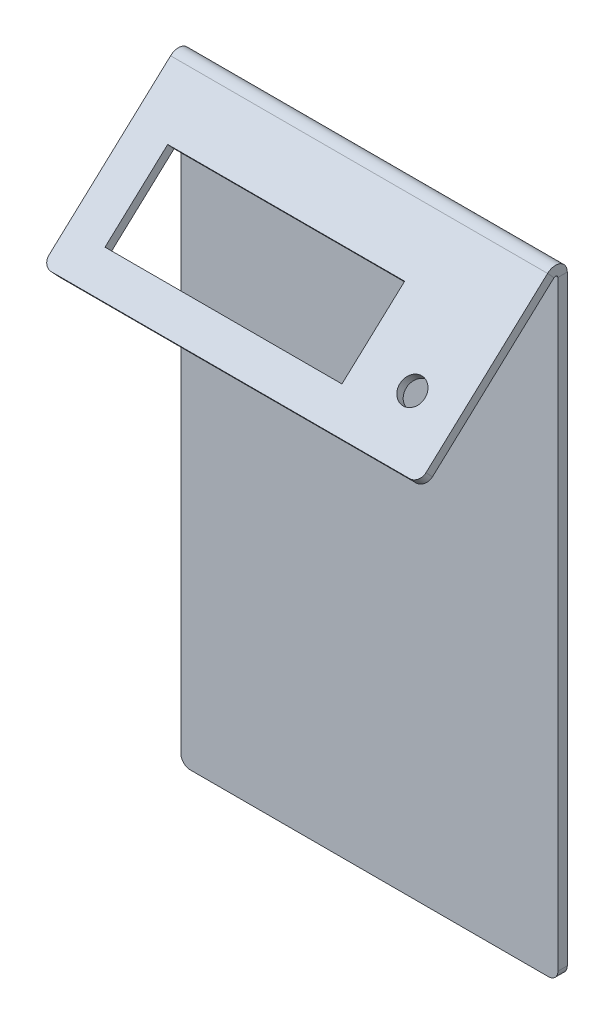
ISO-10303-21;
HEADER;
FILE_DESCRIPTION(('STEP AP214'),'2;1');
FILE_NAME('part.step','',(''),(''),'','','');
FILE_SCHEMA(('AUTOMOTIVE_DESIGN { 1 0 10303 214 1 1 1 1 }'));
ENDSEC;
DATA;
#1=APPLICATION_CONTEXT('core data for automotive mechanical design processes');
#2=APPLICATION_PROTOCOL_DEFINITION('international standard','automotive_design',2000,#1);
#3=PRODUCT_CONTEXT('',#1,'mechanical');
#4=PRODUCT('Part','Part','',(#3));
#5=PRODUCT_RELATED_PRODUCT_CATEGORY('part','',(#4));
#6=PRODUCT_DEFINITION_FORMATION('','',#4);
#7=PRODUCT_DEFINITION_CONTEXT('part definition',#1,'design');
#8=PRODUCT_DEFINITION('design','',#6,#7);
#9=PRODUCT_DEFINITION_SHAPE('','',#8);
#10=(LENGTH_UNIT() NAMED_UNIT(*) SI_UNIT(.MILLI.,.METRE.));
#11=(NAMED_UNIT(*) PLANE_ANGLE_UNIT() SI_UNIT($,.RADIAN.));
#12=(NAMED_UNIT(*) SI_UNIT($,.STERADIAN.) SOLID_ANGLE_UNIT());
#13=UNCERTAINTY_MEASURE_WITH_UNIT(LENGTH_MEASURE(1.E-05),#10,'distance_accuracy_value','');
#14=(GEOMETRIC_REPRESENTATION_CONTEXT(3) GLOBAL_UNCERTAINTY_ASSIGNED_CONTEXT((#13)) GLOBAL_UNIT_ASSIGNED_CONTEXT((#10,
#11,#12)) REPRESENTATION_CONTEXT('',''));
#15=CARTESIAN_POINT('',(0.,0.,0.));
#16=DIRECTION('',(0.,0.,1.));
#17=DIRECTION('',(1.,0.,0.));
#18=AXIS2_PLACEMENT_3D('',#15,#16,#17);
#19=CARTESIAN_POINT('',(0.,0.,-3.));
#20=DIRECTION('',(-1.,0.,0.));
#21=DIRECTION('',(0.,0.,1.));
#22=AXIS2_PLACEMENT_3D('',#19,#20,#21);
#23=PLANE('',#22);
#24=DIRECTION('',(0.,-1.,0.));
#25=VECTOR('',#24,1.);
#26=CARTESIAN_POINT('',(0.,0.,-3.));
#27=LINE('',#26,#25);
#28=CARTESIAN_POINT('',(0.,194.248339821906,-3.));
#29=VERTEX_POINT('',#28);
#30=CARTESIAN_POINT('',(0.,3.,-3.));
#31=VERTEX_POINT('',#30);
#32=EDGE_CURVE('E248',#29,#31,#27,.T.);
#33=ORIENTED_EDGE('',*,*,#32,.T.);
#34=DIRECTION('',(0.,0.,1.));
#35=VECTOR('',#34,1.);
#36=CARTESIAN_POINT('',(0.,3.,-3.));
#37=LINE('',#36,#35);
#38=CARTESIAN_POINT('',(0.,3.,0.));
#39=VERTEX_POINT('',#38);
#40=EDGE_CURVE('E278',#31,#39,#37,.T.);
#41=ORIENTED_EDGE('',*,*,#40,.T.);
#42=DIRECTION('',(0.,-1.,0.));
#43=VECTOR('',#42,1.);
#44=CARTESIAN_POINT('',(0.,0.,0.));
#45=LINE('',#44,#43);
#46=CARTESIAN_POINT('',(0.,194.248339821906,0.));
#47=VERTEX_POINT('',#46);
#48=EDGE_CURVE('E245',#47,#39,#45,.T.);
#49=ORIENTED_EDGE('',*,*,#48,.F.);
#50=DIRECTION('',(0.,0.,1.));
#51=VECTOR('',#50,1.);
#52=CARTESIAN_POINT('',(0.,194.248339821906,-3.));
#53=LINE('',#52,#51);
#54=EDGE_CURVE('E217',#29,#47,#53,.T.);
#55=ORIENTED_EDGE('',*,*,#54,.F.);
#56=EDGE_LOOP('',(#33,#41,#49,#55));
#57=FACE_BOUND('',#56,.T.);
#58=ADVANCED_FACE('F37',(#57),#23,.T.);
#59=CARTESIAN_POINT('',(120.,0.,-3.));
#60=DIRECTION('',(1.,0.,0.));
#61=DIRECTION('',(0.,0.,-1.));
#62=AXIS2_PLACEMENT_3D('',#59,#60,#61);
#63=PLANE('',#62);
#64=DIRECTION('',(0.,1.,0.));
#65=VECTOR('',#64,1.);
#66=CARTESIAN_POINT('',(120.,0.,0.));
#67=LINE('',#66,#65);
#68=CARTESIAN_POINT('',(120.,3.,0.));
#69=VERTEX_POINT('',#68);
#70=CARTESIAN_POINT('',(120.,194.248339821906,0.));
#71=VERTEX_POINT('',#70);
#72=EDGE_CURVE('E252',#69,#71,#67,.T.);
#73=ORIENTED_EDGE('',*,*,#72,.F.);
#74=DIRECTION('',(0.,0.,1.));
#75=VECTOR('',#74,1.);
#76=CARTESIAN_POINT('',(120.,3.,-3.));
#77=LINE('',#76,#75);
#78=CARTESIAN_POINT('',(120.,3.,-3.));
#79=VERTEX_POINT('',#78);
#80=EDGE_CURVE('E272',#69,#79,#77,.F.);
#81=ORIENTED_EDGE('',*,*,#80,.T.);
#82=DIRECTION('',(0.,1.,0.));
#83=VECTOR('',#82,1.);
#84=CARTESIAN_POINT('',(120.,0.,-3.));
#85=LINE('',#84,#83);
#86=CARTESIAN_POINT('',(120.,194.248339821906,-3.));
#87=VERTEX_POINT('',#86);
#88=EDGE_CURVE('E255',#79,#87,#85,.T.);
#89=ORIENTED_EDGE('',*,*,#88,.T.);
#90=DIRECTION('',(0.,0.,1.));
#91=VECTOR('',#90,1.);
#92=CARTESIAN_POINT('',(119.999999999998,194.248339821906,-3.));
#93=LINE('',#92,#91);
#94=EDGE_CURVE('E207',#87,#71,#93,.T.);
#95=ORIENTED_EDGE('',*,*,#94,.T.);
#96=EDGE_LOOP('',(#73,#81,#89,#95));
#97=FACE_BOUND('',#96,.T.);
#98=ADVANCED_FACE('F330',(#97),#63,.T.);
#99=CARTESIAN_POINT('',(0.,0.,-3.));
#100=DIRECTION('',(0.,0.,-1.));
#101=DIRECTION('',(-1.,0.,0.));
#102=AXIS2_PLACEMENT_3D('',#99,#100,#101);
#103=PLANE('',#102);
#104=ORIENTED_EDGE('',*,*,#88,.F.);
#105=CARTESIAN_POINT('',(117.,3.,-3.));
#106=DIRECTION('',(0.,0.,-1.));
#107=DIRECTION('',(-1.,0.,0.));
#108=AXIS2_PLACEMENT_3D('',#105,#106,#107);
#109=CIRCLE('',#108,3.);
#110=CARTESIAN_POINT('',(117.,0.,-3.));
#111=VERTEX_POINT('',#110);
#112=EDGE_CURVE('E276',#79,#111,#109,.T.);
#113=ORIENTED_EDGE('',*,*,#112,.T.);
#114=DIRECTION('',(1.,0.,0.));
#115=VECTOR('',#114,1.);
#116=CARTESIAN_POINT('',(0.,0.,-3.));
#117=LINE('',#116,#115);
#118=CARTESIAN_POINT('',(3.,0.,-3.));
#119=VERTEX_POINT('',#118);
#120=EDGE_CURVE('E251',#119,#111,#117,.T.);
#121=ORIENTED_EDGE('',*,*,#120,.F.);
#122=CARTESIAN_POINT('',(3.,3.,-3.));
#123=DIRECTION('',(0.,0.,-1.));
#124=DIRECTION('',(-1.,0.,0.));
#125=AXIS2_PLACEMENT_3D('',#122,#123,#124);
#126=CIRCLE('',#125,3.);
#127=EDGE_CURVE('E274',#119,#31,#126,.T.);
#128=ORIENTED_EDGE('',*,*,#127,.T.);
#129=ORIENTED_EDGE('',*,*,#32,.F.);
#130=DIRECTION('',(1.,0.,0.));
#131=VECTOR('',#130,1.);
#132=CARTESIAN_POINT('',(-600.,194.248339821906,-3.));
#133=LINE('',#132,#131);
#134=EDGE_CURVE('E208',#29,#87,#133,.T.);
#135=ORIENTED_EDGE('',*,*,#134,.T.);
#136=EDGE_LOOP('',(#104,#113,#121,#128,#129,#135));
#137=FACE_BOUND('',#136,.T.);
#138=ADVANCED_FACE('F324',(#137),#103,.T.);
#139=CARTESIAN_POINT('',(0.,0.,0.));
#140=DIRECTION('',(0.,0.,-1.));
#141=DIRECTION('',(-1.,0.,0.));
#142=AXIS2_PLACEMENT_3D('',#139,#140,#141);
#143=PLANE('',#142);
#144=DIRECTION('',(1.,0.,0.));
#145=VECTOR('',#144,1.);
#146=CARTESIAN_POINT('',(0.,0.,0.));
#147=LINE('',#146,#145);
#148=CARTESIAN_POINT('',(3.,0.,0.));
#149=VERTEX_POINT('',#148);
#150=CARTESIAN_POINT('',(117.,0.,0.));
#151=VERTEX_POINT('',#150);
#152=EDGE_CURVE('E260',#149,#151,#147,.T.);
#153=ORIENTED_EDGE('',*,*,#152,.T.);
#154=CARTESIAN_POINT('',(117.,3.,0.));
#155=DIRECTION('',(0.,0.,-1.));
#156=DIRECTION('',(-1.,0.,0.));
#157=AXIS2_PLACEMENT_3D('',#154,#155,#156);
#158=CIRCLE('',#157,3.);
#159=EDGE_CURVE('E270',#151,#69,#158,.F.);
#160=ORIENTED_EDGE('',*,*,#159,.T.);
#161=ORIENTED_EDGE('',*,*,#72,.T.);
#162=DIRECTION('',(1.,0.,0.));
#163=VECTOR('',#162,1.);
#164=CARTESIAN_POINT('',(-600.,194.248339821906,0.));
#165=LINE('',#164,#163);
#166=EDGE_CURVE('E197',#47,#71,#165,.T.);
#167=ORIENTED_EDGE('',*,*,#166,.F.);
#168=ORIENTED_EDGE('',*,*,#48,.T.);
#169=CARTESIAN_POINT('',(3.,3.,0.));
#170=DIRECTION('',(0.,0.,-1.));
#171=DIRECTION('',(-1.,0.,0.));
#172=AXIS2_PLACEMENT_3D('',#169,#170,#171);
#173=CIRCLE('',#172,3.);
#174=EDGE_CURVE('E268',#39,#149,#173,.F.);
#175=ORIENTED_EDGE('',*,*,#174,.T.);
#176=EDGE_LOOP('',(#153,#160,#161,#167,#168,#175));
#177=FACE_BOUND('',#176,.T.);
#178=ADVANCED_FACE('F333',(#177),#143,.F.);
#179=CARTESIAN_POINT('',(0.,0.,-3.));
#180=DIRECTION('',(0.,-1.,0.));
#181=DIRECTION('',(0.,0.,-1.));
#182=AXIS2_PLACEMENT_3D('',#179,#180,#181);
#183=PLANE('',#182);
#184=ORIENTED_EDGE('',*,*,#120,.T.);
#185=DIRECTION('',(0.,0.,1.));
#186=VECTOR('',#185,1.);
#187=CARTESIAN_POINT('',(117.,0.,-3.));
#188=LINE('',#187,#186);
#189=EDGE_CURVE('E265',#111,#151,#188,.T.);
#190=ORIENTED_EDGE('',*,*,#189,.T.);
#191=ORIENTED_EDGE('',*,*,#152,.F.);
#192=DIRECTION('',(0.,0.,1.));
#193=VECTOR('',#192,1.);
#194=CARTESIAN_POINT('',(3.,0.,-3.));
#195=LINE('',#194,#193);
#196=EDGE_CURVE('E257',#149,#119,#195,.F.);
#197=ORIENTED_EDGE('',*,*,#196,.T.);
#198=EDGE_LOOP('',(#184,#190,#191,#197));
#199=FACE_BOUND('',#198,.T.);
#200=ADVANCED_FACE('F339',(#199),#183,.T.);
#201=CARTESIAN_POINT('',(0.,159.401451515513,44.1787037038518));
#202=DIRECTION('',(0.,0.676642474741551,-0.736311728397443));
#203=DIRECTION('',(1.,0.,0.));
#204=AXIS2_PLACEMENT_3D('',#201,#202,#203);
#205=PLANE('',#204);
#206=DIRECTION('',(1.,0.,0.));
#207=VECTOR('',#206,1.);
#208=CARTESIAN_POINT('',(0.,159.401451515513,44.1787037038518));
#209=LINE('',#208,#207);
#210=CARTESIAN_POINT('',(3.,159.401451515513,44.1787037038518));
#211=VERTEX_POINT('',#210);
#212=CARTESIAN_POINT('',(117.,159.401451515513,44.1787037038518));
#213=VERTEX_POINT('',#212);
#214=EDGE_CURVE('E220',#211,#213,#209,.T.);
#215=ORIENTED_EDGE('',*,*,#214,.F.);
#216=DIRECTION('',(0.,-0.736311728397443,-0.676642474741551));
#217=VECTOR('',#216,1.);
#218=CARTESIAN_POINT('',(3.,159.401451515513,44.1787037038518));
#219=LINE('',#218,#217);
#220=CARTESIAN_POINT('',(3.,157.19251633032,42.1487762796271));
#221=VERTEX_POINT('',#220);
#222=EDGE_CURVE('E283',#211,#221,#219,.T.);
#223=ORIENTED_EDGE('',*,*,#222,.T.);
#224=DIRECTION('',(1.,0.,0.));
#225=VECTOR('',#224,1.);
#226=CARTESIAN_POINT('',(0.,157.19251633032,42.1487762796271));
#227=LINE('',#226,#225);
#228=CARTESIAN_POINT('',(117.,157.19251633032,42.1487762796271));
#229=VERTEX_POINT('',#228);
#230=EDGE_CURVE('E228',#221,#229,#227,.T.);
#231=ORIENTED_EDGE('',*,*,#230,.T.);
#232=DIRECTION('',(0.,-0.736311728397443,-0.676642474741551));
#233=VECTOR('',#232,1.);
#234=CARTESIAN_POINT('',(117.,159.401451515513,44.1787037038518));
#235=LINE('',#234,#233);
#236=EDGE_CURVE('E281',#229,#213,#235,.F.);
#237=ORIENTED_EDGE('',*,*,#236,.T.);
#238=EDGE_LOOP('',(#215,#223,#231,#237));
#239=FACE_BOUND('',#238,.T.);
#240=ADVANCED_FACE('F298',(#239),#205,.F.);
#241=CARTESIAN_POINT('',(0.,159.401451515513,44.1787037038518));
#242=DIRECTION('',(-1.,0.,0.));
#243=DIRECTION('',(0.,0.676642474741551,-0.736311728397443));
#244=AXIS2_PLACEMENT_3D('',#241,#242,#243);
#245=PLANE('',#244);
#246=DIRECTION('',(0.,0.676642474741551,-0.736311728397443));
#247=VECTOR('',#246,1.);
#248=CARTESIAN_POINT('',(0.,157.19251633032,42.1487762796271));
#249=LINE('',#248,#247);
#250=CARTESIAN_POINT('',(0.,159.222443754545,39.9398410944348));
#251=VERTEX_POINT('',#250);
#252=CARTESIAN_POINT('',(0.,194.790707041044,1.23501484689463));
#253=VERTEX_POINT('',#252);
#254=EDGE_CURVE('E226',#251,#253,#249,.T.);
#255=ORIENTED_EDGE('',*,*,#254,.F.);
#256=DIRECTION('',(0.,0.736311728397443,0.676642474741551));
#257=VECTOR('',#256,1.);
#258=CARTESIAN_POINT('',(0.,161.431378939737,41.9697685186594));
#259=LINE('',#258,#257);
#260=CARTESIAN_POINT('',(0.,161.431378939737,41.9697685186594));
#261=VERTEX_POINT('',#260);
#262=EDGE_CURVE('E60',#251,#261,#259,.T.);
#263=ORIENTED_EDGE('',*,*,#262,.T.);
#264=DIRECTION('',(0.,0.676642474741551,-0.736311728397443));
#265=VECTOR('',#264,1.);
#266=CARTESIAN_POINT('',(0.,159.401451515513,44.1787037038518));
#267=LINE('',#266,#265);
#268=CARTESIAN_POINT('',(0.,196.999642226236,3.26494227111928));
#269=VERTEX_POINT('',#268);
#270=EDGE_CURVE('E235',#261,#269,#267,.T.);
#271=ORIENTED_EDGE('',*,*,#270,.T.);
#272=DIRECTION('',(0.,-0.736311728397443,-0.676642474741551));
#273=VECTOR('',#272,1.);
#274=CARTESIAN_POINT('',(0.,196.999642226236,3.26494227111928));
#275=LINE('',#274,#273);
#276=EDGE_CURVE('E242',#269,#253,#275,.T.);
#277=ORIENTED_EDGE('',*,*,#276,.T.);
#278=EDGE_LOOP('',(#255,#263,#271,#277));
#279=FACE_BOUND('',#278,.T.);
#280=ADVANCED_FACE('F302',(#279),#245,.T.);
#281=CARTESIAN_POINT('',(120.,159.401451515513,44.1787037038518));
#282=DIRECTION('',(1.,0.,0.));
#283=DIRECTION('',(0.,-0.676642474741551,0.736311728397443));
#284=AXIS2_PLACEMENT_3D('',#281,#282,#283);
#285=PLANE('',#284);
#286=DIRECTION('',(0.,-0.676642474741551,0.736311728397443));
#287=VECTOR('',#286,1.);
#288=CARTESIAN_POINT('',(120.,159.401451515513,44.1787037038518));
#289=LINE('',#288,#287);
#290=CARTESIAN_POINT('',(119.999999999998,196.999642226236,3.26494227111928));
#291=VERTEX_POINT('',#290);
#292=CARTESIAN_POINT('',(120.,161.431378939737,41.9697685186594));
#293=VERTEX_POINT('',#292);
#294=EDGE_CURVE('E231',#291,#293,#289,.T.);
#295=ORIENTED_EDGE('',*,*,#294,.T.);
#296=DIRECTION('',(0.,0.736311728397443,0.676642474741551));
#297=VECTOR('',#296,1.);
#298=CARTESIAN_POINT('',(120.,161.431378939737,41.9697685186594));
#299=LINE('',#298,#297);
#300=CARTESIAN_POINT('',(120.,159.222443754545,39.9398410944348));
#301=VERTEX_POINT('',#300);
#302=EDGE_CURVE('E11',#293,#301,#299,.F.);
#303=ORIENTED_EDGE('',*,*,#302,.T.);
#304=DIRECTION('',(0.,0.676642474741551,-0.736311728397443));
#305=VECTOR('',#304,1.);
#306=CARTESIAN_POINT('',(120.,157.19251633032,42.1487762796271));
#307=LINE('',#306,#305);
#308=CARTESIAN_POINT('',(120.,194.790707041044,1.23501484689463));
#309=VERTEX_POINT('',#308);
#310=EDGE_CURVE('E225',#309,#301,#307,.F.);
#311=ORIENTED_EDGE('',*,*,#310,.F.);
#312=DIRECTION('',(0.,-0.736311728397443,-0.676642474741551));
#313=VECTOR('',#312,1.);
#314=CARTESIAN_POINT('',(120.,196.999642226236,3.26494227111928));
#315=LINE('',#314,#313);
#316=EDGE_CURVE('E234',#291,#309,#315,.T.);
#317=ORIENTED_EDGE('',*,*,#316,.F.);
#318=EDGE_LOOP('',(#295,#303,#311,#317));
#319=FACE_BOUND('',#318,.T.);
#320=ADVANCED_FACE('F366',(#319),#285,.T.);
#321=CARTESIAN_POINT('',(0.,157.19251633032,42.1487762796271));
#322=DIRECTION('',(0.,-0.736311728397443,-0.676642474741551));
#323=DIRECTION('',(0.,0.676642474741551,-0.736311728397443));
#324=AXIS2_PLACEMENT_3D('',#321,#322,#323);
#325=PLANE('',#324);
#326=CARTESIAN_POINT('',(105.046682515464,168.988830820657,29.3122118673547));
#327=DIRECTION('',(0.,-0.736311728397443,-0.676642474741551));
#328=DIRECTION('',(0.,0.676642474741551,-0.736311728397443));
#329=AXIS2_PLACEMENT_3D('',#326,#327,#328);
#330=CIRCLE('',#329,4.00000000000001);
#331=CARTESIAN_POINT('',(105.046682515464,171.695400719623,26.3669649537649));
#332=VERTEX_POINT('',#331);
#333=EDGE_CURVE('E212',#332,#332,#330,.F.);
#334=ORIENTED_EDGE('',*,*,#333,.T.);
#335=EDGE_LOOP('',(#334));
#336=FACE_BOUND('',#335,.T.);
#337=DIRECTION('',(1.,0.,0.));
#338=VECTOR('',#337,1.);
#339=CARTESIAN_POINT('',(12.0574370536026,164.526131444519,34.1684513344633));
#340=LINE('',#339,#338);
#341=CARTESIAN_POINT('',(12.0574370536026,164.526131444519,34.1684513344633));
#342=VERTEX_POINT('',#341);
#343=CARTESIAN_POINT('',(87.472501623779,164.526131444519,34.1684513344633));
#344=VERTEX_POINT('',#343);
#345=EDGE_CURVE('E166',#342,#344,#340,.T.);
#346=ORIENTED_EDGE('',*,*,#345,.T.);
#347=DIRECTION('',(0.,0.676642474741551,-0.736311728397443));
#348=VECTOR('',#347,1.);
#349=CARTESIAN_POINT('',(87.472501623779,164.526131444519,34.1684513344633));
#350=LINE('',#349,#348);
#351=CARTESIAN_POINT('',(87.472501623779,182.867003850979,14.2102016442179));
#352=VERTEX_POINT('',#351);
#353=EDGE_CURVE('E152',#344,#352,#350,.T.);
#354=ORIENTED_EDGE('',*,*,#353,.T.);
#355=DIRECTION('',(-1.,0.,0.));
#356=VECTOR('',#355,1.);
#357=CARTESIAN_POINT('',(12.0574370536026,182.867003850979,14.2102016442179));
#358=LINE('',#357,#356);
#359=CARTESIAN_POINT('',(12.0574370536026,182.867003850979,14.2102016442179));
#360=VERTEX_POINT('',#359);
#361=EDGE_CURVE('E191',#352,#360,#358,.T.);
#362=ORIENTED_EDGE('',*,*,#361,.T.);
#363=DIRECTION('',(0.,-0.676642474741551,0.736311728397443));
#364=VECTOR('',#363,1.);
#365=CARTESIAN_POINT('',(12.0574370536026,164.526131444519,34.1684513344633));
#366=LINE('',#365,#364);
#367=EDGE_CURVE('E174',#360,#342,#366,.T.);
#368=ORIENTED_EDGE('',*,*,#367,.T.);
#369=EDGE_LOOP('',(#346,#354,#362,#368));
#370=FACE_BOUND('',#369,.T.);
#371=ORIENTED_EDGE('',*,*,#230,.F.);
#372=CARTESIAN_POINT('',(3.,159.222443754545,39.9398410944348));
#373=DIRECTION('',(0.,-0.736311728397443,-0.676642474741551));
#374=DIRECTION('',(0.,0.676642474741551,-0.736311728397443));
#375=AXIS2_PLACEMENT_3D('',#372,#373,#374);
#376=CIRCLE('',#375,3.);
#377=EDGE_CURVE('E288',#221,#251,#376,.T.);
#378=ORIENTED_EDGE('',*,*,#377,.T.);
#379=ORIENTED_EDGE('',*,*,#254,.T.);
#380=DIRECTION('',(1.,0.,0.));
#381=VECTOR('',#380,1.);
#382=CARTESIAN_POINT('',(0.,194.790707041044,1.23501484689463));
#383=LINE('',#382,#381);
#384=EDGE_CURVE('E223',#253,#309,#383,.T.);
#385=ORIENTED_EDGE('',*,*,#384,.T.);
#386=ORIENTED_EDGE('',*,*,#310,.T.);
#387=CARTESIAN_POINT('',(117.,159.222443754545,39.9398410944348));
#388=DIRECTION('',(0.,-0.736311728397443,-0.676642474741551));
#389=DIRECTION('',(0.,0.676642474741551,-0.736311728397443));
#390=AXIS2_PLACEMENT_3D('',#387,#388,#389);
#391=CIRCLE('',#390,3.);
#392=EDGE_CURVE('E286',#301,#229,#391,.T.);
#393=ORIENTED_EDGE('',*,*,#392,.T.);
#394=EDGE_LOOP('',(#371,#378,#379,#385,#386,#393));
#395=FACE_BOUND('',#394,.T.);
#396=ADVANCED_FACE('F172',(#336,#370,#395),#325,.T.);
#397=CARTESIAN_POINT('',(0.,159.401451515513,44.1787037038518));
#398=DIRECTION('',(0.,-0.736311728397443,-0.676642474741551));
#399=DIRECTION('',(0.,0.676642474741551,-0.736311728397443));
#400=AXIS2_PLACEMENT_3D('',#397,#398,#399);
#401=PLANE('',#400);
#402=CARTESIAN_POINT('',(105.046682515464,171.197766005849,31.3421392915794));
#403=DIRECTION('',(0.,0.736311728397443,0.676642474741551));
#404=DIRECTION('',(0.,-0.676642474741551,0.736311728397443));
#405=AXIS2_PLACEMENT_3D('',#402,#403,#404);
#406=CIRCLE('',#405,4.00000000000001);
#407=CARTESIAN_POINT('',(105.046682515464,168.491196106883,34.2873862051692));
#408=VERTEX_POINT('',#407);
#409=EDGE_CURVE('E180',#408,#408,#406,.T.);
#410=ORIENTED_EDGE('',*,*,#409,.F.);
#411=EDGE_LOOP('',(#410));
#412=FACE_BOUND('',#411,.T.);
#413=DIRECTION('',(0.,0.676642474741551,-0.736311728397443));
#414=VECTOR('',#413,1.);
#415=CARTESIAN_POINT('',(87.472501623779,166.735066629711,36.198378758688));
#416=LINE('',#415,#414);
#417=CARTESIAN_POINT('',(87.472501623779,166.735066629711,36.198378758688));
#418=VERTEX_POINT('',#417);
#419=CARTESIAN_POINT('',(87.472501623779,185.075939036171,16.2401290684426));
#420=VERTEX_POINT('',#419);
#421=EDGE_CURVE('E177',#418,#420,#416,.T.);
#422=ORIENTED_EDGE('',*,*,#421,.F.);
#423=DIRECTION('',(1.,0.,0.));
#424=VECTOR('',#423,1.);
#425=CARTESIAN_POINT('',(12.0574370536026,166.735066629711,36.198378758688));
#426=LINE('',#425,#424);
#427=CARTESIAN_POINT('',(12.0574370536026,166.735066629711,36.198378758688));
#428=VERTEX_POINT('',#427);
#429=EDGE_CURVE('E169',#428,#418,#426,.T.);
#430=ORIENTED_EDGE('',*,*,#429,.F.);
#431=DIRECTION('',(0.,-0.676642474741551,0.736311728397443));
#432=VECTOR('',#431,1.);
#433=CARTESIAN_POINT('',(12.0574370536026,166.735066629711,36.198378758688));
#434=LINE('',#433,#432);
#435=CARTESIAN_POINT('',(12.0574370536026,185.075939036171,16.2401290684425));
#436=VERTEX_POINT('',#435);
#437=EDGE_CURVE('E185',#436,#428,#434,.T.);
#438=ORIENTED_EDGE('',*,*,#437,.F.);
#439=DIRECTION('',(-1.,0.,0.));
#440=VECTOR('',#439,1.);
#441=CARTESIAN_POINT('',(12.0574370536026,185.075939036171,16.2401290684426));
#442=LINE('',#441,#440);
#443=EDGE_CURVE('E175',#420,#436,#442,.T.);
#444=ORIENTED_EDGE('',*,*,#443,.F.);
#445=EDGE_LOOP('',(#422,#430,#438,#444));
#446=FACE_BOUND('',#445,.T.);
#447=ORIENTED_EDGE('',*,*,#270,.F.);
#448=CARTESIAN_POINT('',(3.,161.431378939737,41.9697685186594));
#449=DIRECTION('',(0.,-0.736311728397443,-0.676642474741551));
#450=DIRECTION('',(0.,0.676642474741551,-0.736311728397443));
#451=AXIS2_PLACEMENT_3D('',#448,#449,#450);
#452=CIRCLE('',#451,3.);
#453=EDGE_CURVE('E45',#261,#211,#452,.F.);
#454=ORIENTED_EDGE('',*,*,#453,.T.);
#455=ORIENTED_EDGE('',*,*,#214,.T.);
#456=CARTESIAN_POINT('',(117.,161.431378939737,41.9697685186594));
#457=DIRECTION('',(0.,-0.736311728397443,-0.676642474741551));
#458=DIRECTION('',(0.,0.676642474741551,-0.736311728397443));
#459=AXIS2_PLACEMENT_3D('',#456,#457,#458);
#460=CIRCLE('',#459,3.);
#461=EDGE_CURVE('E52',#213,#293,#460,.F.);
#462=ORIENTED_EDGE('',*,*,#461,.T.);
#463=ORIENTED_EDGE('',*,*,#294,.F.);
#464=DIRECTION('',(1.,0.,0.));
#465=VECTOR('',#464,1.);
#466=CARTESIAN_POINT('',(0.,196.999642226236,3.26494227111928));
#467=LINE('',#466,#465);
#468=EDGE_CURVE('E237',#269,#291,#467,.T.);
#469=ORIENTED_EDGE('',*,*,#468,.F.);
#470=EDGE_LOOP('',(#447,#454,#455,#462,#463,#469));
#471=FACE_BOUND('',#470,.T.);
#472=ADVANCED_FACE('F293',(#412,#446,#471),#401,.F.);
#473=CARTESIAN_POINT('',(0.,194.248339821906,0.736599999999998));
#474=DIRECTION('',(1.,0.,0.));
#475=DIRECTION('',(0.,0.,-1.));
#476=AXIS2_PLACEMENT_3D('',#473,#474,#475);
#477=PLANE('',#476);
#478=ORIENTED_EDGE('',*,*,#276,.F.);
#479=CARTESIAN_POINT('',(0.,194.248339821906,0.736599999999998));
#480=DIRECTION('',(-1.,0.,0.));
#481=DIRECTION('',(0.,0.,1.));
#482=AXIS2_PLACEMENT_3D('',#479,#480,#481);
#483=CIRCLE('',#482,3.7366);
#484=EDGE_CURVE('E211',#269,#29,#483,.T.);
#485=ORIENTED_EDGE('',*,*,#484,.T.);
#486=ORIENTED_EDGE('',*,*,#54,.T.);
#487=CARTESIAN_POINT('',(0.,194.248339821906,0.736599999999998));
#488=DIRECTION('',(1.,0.,0.));
#489=DIRECTION('',(0.,0.,-1.));
#490=AXIS2_PLACEMENT_3D('',#487,#488,#489);
#491=CIRCLE('',#490,0.7366);
#492=EDGE_CURVE('E200',#253,#47,#491,.F.);
#493=ORIENTED_EDGE('',*,*,#492,.F.);
#494=EDGE_LOOP('',(#478,#485,#486,#493));
#495=FACE_BOUND('',#494,.T.);
#496=ADVANCED_FACE('F312',(#495),#477,.F.);
#497=CARTESIAN_POINT('',(120.000000000005,194.248339821906,0.736599999999998));
#498=DIRECTION('',(-1.,-1.65450986244764E-12,0.));
#499=DIRECTION('',(1.65450986244764E-12,-1.,0.));
#500=AXIS2_PLACEMENT_3D('',#497,#498,#499);
#501=PLANE('',#500);
#502=CARTESIAN_POINT('',(120.000000000005,194.248339821906,0.736599999999998));
#503=DIRECTION('',(1.,1.65450986244764E-12,0.));
#504=DIRECTION('',(-1.65450986244764E-12,1.,0.));
#505=AXIS2_PLACEMENT_3D('',#502,#503,#504);
#506=CIRCLE('',#505,3.7366);
#507=EDGE_CURVE('E201',#87,#291,#506,.T.);
#508=ORIENTED_EDGE('',*,*,#507,.T.);
#509=ORIENTED_EDGE('',*,*,#316,.T.);
#510=CARTESIAN_POINT('',(119.999999999998,194.248339821906,0.736599999999998));
#511=DIRECTION('',(1.,0.,0.));
#512=DIRECTION('',(0.,0.,-1.));
#513=AXIS2_PLACEMENT_3D('',#510,#511,#512);
#514=CIRCLE('',#513,0.7366);
#515=EDGE_CURVE('E204',#71,#309,#514,.T.);
#516=ORIENTED_EDGE('',*,*,#515,.F.);
#517=ORIENTED_EDGE('',*,*,#94,.F.);
#518=EDGE_LOOP('',(#508,#509,#516,#517));
#519=FACE_BOUND('',#518,.T.);
#520=ADVANCED_FACE('F327',(#519),#501,.F.);
#521=CARTESIAN_POINT('',(-600.,194.248339821906,0.736599999999998));
#522=DIRECTION('',(1.,0.,0.));
#523=DIRECTION('',(0.,0.,-1.));
#524=AXIS2_PLACEMENT_3D('',#521,#522,#523);
#525=CYLINDRICAL_SURFACE('',#524,0.7366);
#526=ORIENTED_EDGE('',*,*,#166,.T.);
#527=ORIENTED_EDGE('',*,*,#515,.T.);
#528=ORIENTED_EDGE('',*,*,#384,.F.);
#529=ORIENTED_EDGE('',*,*,#492,.T.);
#530=EDGE_LOOP('',(#526,#527,#528,#529));
#531=FACE_BOUND('',#530,.T.);
#532=ADVANCED_FACE('F309',(#531),#525,.F.);
#533=CARTESIAN_POINT('',(-600.,194.248339821906,0.736599999999998));
#534=DIRECTION('',(1.,0.,0.));
#535=DIRECTION('',(0.,0.,-1.));
#536=AXIS2_PLACEMENT_3D('',#533,#534,#535);
#537=CYLINDRICAL_SURFACE('',#536,3.7366);
#538=ORIENTED_EDGE('',*,*,#134,.F.);
#539=ORIENTED_EDGE('',*,*,#484,.F.);
#540=ORIENTED_EDGE('',*,*,#468,.T.);
#541=ORIENTED_EDGE('',*,*,#507,.F.);
#542=EDGE_LOOP('',(#538,#539,#540,#541));
#543=FACE_BOUND('',#542,.T.);
#544=ADVANCED_FACE('F320',(#543),#537,.T.);
#545=CARTESIAN_POINT('',(12.0574370536026,56.8083746095762,-64.8200704388339));
#546=DIRECTION('',(0.,-0.676642474741551,0.736311728397443));
#547=DIRECTION('',(0.,-0.736311728397443,-0.676642474741551));
#548=AXIS2_PLACEMENT_3D('',#545,#546,#547);
#549=PLANE('',#548);
#550=DIRECTION('',(0.,0.736311728397443,0.676642474741551));
#551=VECTOR('',#550,1.);
#552=CARTESIAN_POINT('',(12.0574370536026,56.8083746095762,-64.8200704388339));
#553=LINE('',#552,#551);
#554=EDGE_CURVE('E189',#342,#428,#553,.T.);
#555=ORIENTED_EDGE('',*,*,#554,.T.);
#556=ORIENTED_EDGE('',*,*,#429,.T.);
#557=DIRECTION('',(0.,0.736311728397443,0.676642474741551));
#558=VECTOR('',#557,1.);
#559=CARTESIAN_POINT('',(87.472501623779,56.8083746095762,-64.8200704388339));
#560=LINE('',#559,#558);
#561=EDGE_CURVE('E156',#344,#418,#560,.T.);
#562=ORIENTED_EDGE('',*,*,#561,.F.);
#563=ORIENTED_EDGE('',*,*,#345,.F.);
#564=EDGE_LOOP('',(#555,#556,#562,#563));
#565=FACE_BOUND('',#564,.T.);
#566=ADVANCED_FACE('F165',(#565),#549,.F.);
#567=CARTESIAN_POINT('',(87.472501623779,56.8083746095762,-64.8200704388339));
#568=DIRECTION('',(1.,0.,0.));
#569=DIRECTION('',(0.,0.,-1.));
#570=AXIS2_PLACEMENT_3D('',#567,#568,#569);
#571=PLANE('',#570);
#572=ORIENTED_EDGE('',*,*,#561,.T.);
#573=ORIENTED_EDGE('',*,*,#421,.T.);
#574=DIRECTION('',(0.,0.736311728397443,0.676642474741551));
#575=VECTOR('',#574,1.);
#576=CARTESIAN_POINT('',(87.472501623779,75.1492470160361,-84.7783201290793));
#577=LINE('',#576,#575);
#578=EDGE_CURVE('E158',#352,#420,#577,.T.);
#579=ORIENTED_EDGE('',*,*,#578,.F.);
#580=ORIENTED_EDGE('',*,*,#353,.F.);
#581=EDGE_LOOP('',(#572,#573,#579,#580));
#582=FACE_BOUND('',#581,.T.);
#583=ADVANCED_FACE('F154',(#582),#571,.F.);
#584=CARTESIAN_POINT('',(12.0574370536026,75.1492470160361,-84.7783201290793));
#585=DIRECTION('',(0.,0.676642474741551,-0.736311728397443));
#586=DIRECTION('',(0.,0.736311728397443,0.676642474741551));
#587=AXIS2_PLACEMENT_3D('',#584,#585,#586);
#588=PLANE('',#587);
#589=ORIENTED_EDGE('',*,*,#578,.T.);
#590=ORIENTED_EDGE('',*,*,#443,.T.);
#591=DIRECTION('',(0.,0.736311728397443,0.676642474741551));
#592=VECTOR('',#591,1.);
#593=CARTESIAN_POINT('',(12.0574370536026,75.1492470160361,-84.7783201290793));
#594=LINE('',#593,#592);
#595=EDGE_CURVE('E190',#360,#436,#594,.T.);
#596=ORIENTED_EDGE('',*,*,#595,.F.);
#597=ORIENTED_EDGE('',*,*,#361,.F.);
#598=EDGE_LOOP('',(#589,#590,#596,#597));
#599=FACE_BOUND('',#598,.T.);
#600=ADVANCED_FACE('F392',(#599),#588,.F.);
#601=CARTESIAN_POINT('',(12.0574370536026,56.8083746095762,-64.8200704388339));
#602=DIRECTION('',(-1.,0.,0.));
#603=DIRECTION('',(0.,0.,1.));
#604=AXIS2_PLACEMENT_3D('',#601,#602,#603);
#605=PLANE('',#604);
#606=ORIENTED_EDGE('',*,*,#595,.T.);
#607=ORIENTED_EDGE('',*,*,#437,.T.);
#608=ORIENTED_EDGE('',*,*,#554,.F.);
#609=ORIENTED_EDGE('',*,*,#367,.F.);
#610=EDGE_LOOP('',(#606,#607,#608,#609));
#611=FACE_BOUND('',#610,.T.);
#612=ADVANCED_FACE('F395',(#611),#605,.F.);
#613=CARTESIAN_POINT('',(105.046682515464,61.2710739857136,-69.6763099059425));
#614=DIRECTION('',(0.,0.736311728397443,0.676642474741551));
#615=DIRECTION('',(0.,-0.676642474741551,0.736311728397443));
#616=AXIS2_PLACEMENT_3D('',#613,#614,#615);
#617=CYLINDRICAL_SURFACE('',#616,4.00000000000001);
#618=ORIENTED_EDGE('',*,*,#333,.F.);
#619=EDGE_LOOP('',(#618));
#620=FACE_BOUND('',#619,.T.);
#621=ORIENTED_EDGE('',*,*,#409,.T.);
#622=EDGE_LOOP('',(#621));
#623=FACE_BOUND('',#622,.T.);
#624=ADVANCED_FACE('F351',(#620,#623),#617,.F.);
#625=CARTESIAN_POINT('',(117.,3.,-3.));
#626=DIRECTION('',(0.,0.,1.));
#627=DIRECTION('',(1.,0.,0.));
#628=AXIS2_PLACEMENT_3D('',#625,#626,#627);
#629=CYLINDRICAL_SURFACE('',#628,3.);
#630=ORIENTED_EDGE('',*,*,#112,.F.);
#631=ORIENTED_EDGE('',*,*,#80,.F.);
#632=ORIENTED_EDGE('',*,*,#159,.F.);
#633=ORIENTED_EDGE('',*,*,#189,.F.);
#634=EDGE_LOOP('',(#630,#631,#632,#633));
#635=FACE_BOUND('',#634,.T.);
#636=ADVANCED_FACE('F337',(#635),#629,.T.);
#637=CARTESIAN_POINT('',(3.,3.,-3.));
#638=DIRECTION('',(0.,0.,1.));
#639=DIRECTION('',(1.,0.,0.));
#640=AXIS2_PLACEMENT_3D('',#637,#638,#639);
#641=CYLINDRICAL_SURFACE('',#640,3.);
#642=ORIENTED_EDGE('',*,*,#127,.F.);
#643=ORIENTED_EDGE('',*,*,#196,.F.);
#644=ORIENTED_EDGE('',*,*,#174,.F.);
#645=ORIENTED_EDGE('',*,*,#40,.F.);
#646=EDGE_LOOP('',(#642,#643,#644,#645));
#647=FACE_BOUND('',#646,.T.);
#648=ADVANCED_FACE('F344',(#647),#641,.T.);
#649=CARTESIAN_POINT('',(3.,161.431378939737,41.9697685186594));
#650=DIRECTION('',(0.,0.736311728397443,0.676642474741551));
#651=DIRECTION('',(0.,-0.676642474741551,0.736311728397443));
#652=AXIS2_PLACEMENT_3D('',#649,#650,#651);
#653=CYLINDRICAL_SURFACE('',#652,3.);
#654=ORIENTED_EDGE('',*,*,#453,.F.);
#655=ORIENTED_EDGE('',*,*,#262,.F.);
#656=ORIENTED_EDGE('',*,*,#377,.F.);
#657=ORIENTED_EDGE('',*,*,#222,.F.);
#658=EDGE_LOOP('',(#654,#655,#656,#657));
#659=FACE_BOUND('',#658,.T.);
#660=ADVANCED_FACE('F301',(#659),#653,.T.);
#661=CARTESIAN_POINT('',(117.,161.431378939737,41.9697685186594));
#662=DIRECTION('',(0.,0.736311728397443,0.676642474741551));
#663=DIRECTION('',(0.,-0.676642474741551,0.736311728397443));
#664=AXIS2_PLACEMENT_3D('',#661,#662,#663);
#665=CYLINDRICAL_SURFACE('',#664,3.);
#666=ORIENTED_EDGE('',*,*,#461,.F.);
#667=ORIENTED_EDGE('',*,*,#236,.F.);
#668=ORIENTED_EDGE('',*,*,#392,.F.);
#669=ORIENTED_EDGE('',*,*,#302,.F.);
#670=EDGE_LOOP('',(#666,#667,#668,#669));
#671=FACE_BOUND('',#670,.T.);
#672=ADVANCED_FACE('F39',(#671),#665,.T.);
#673=CLOSED_SHELL('',(#58,#98,#138,#178,#200,#240,#280,#320,#396,#472,#496,#520,#532,#544,#566,
#583,#600,#612,#624,#636,#648,#660,#672));
#674=MANIFOLD_SOLID_BREP('B2',#673);
#675=ADVANCED_BREP_SHAPE_REPRESENTATION('',(#18,#674),#14);
#676=SHAPE_DEFINITION_REPRESENTATION(#9,#675);
ENDSEC;
END-ISO-10303-21;
